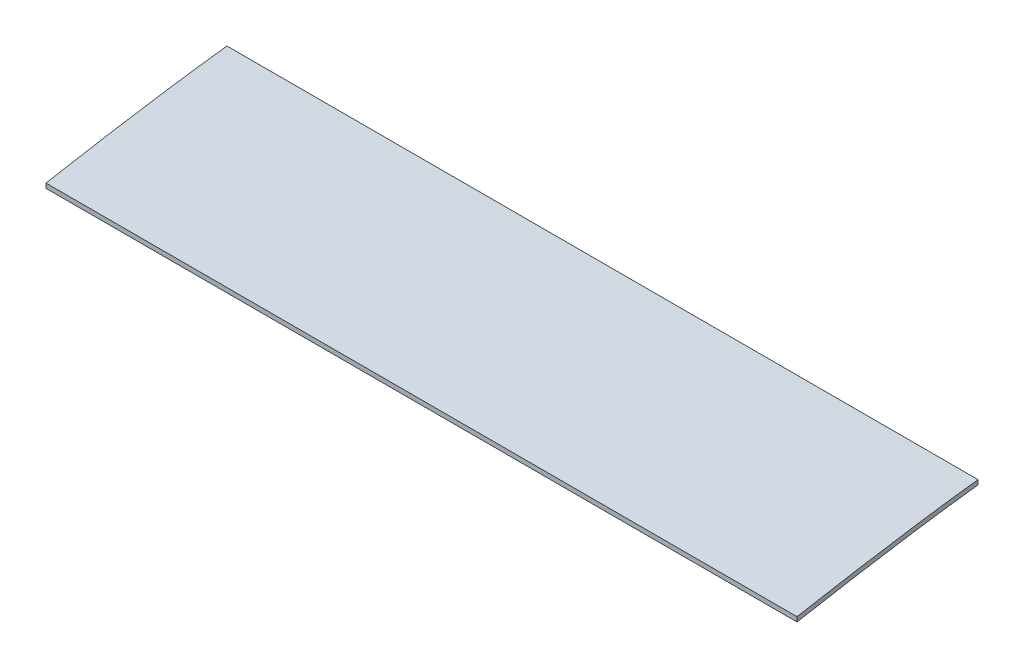
ISO-10303-21;
HEADER;
FILE_DESCRIPTION(('STEP AP214'),'2;1');
FILE_NAME('part.step','',(''),(''),'','','');
FILE_SCHEMA(('AUTOMOTIVE_DESIGN { 1 0 10303 214 1 1 1 1 }'));
ENDSEC;
DATA;
#1=APPLICATION_CONTEXT('core data for automotive mechanical design processes');
#2=APPLICATION_PROTOCOL_DEFINITION('international standard','automotive_design',2000,#1);
#3=PRODUCT_CONTEXT('',#1,'mechanical');
#4=PRODUCT('Part','Part','',(#3));
#5=PRODUCT_RELATED_PRODUCT_CATEGORY('part','',(#4));
#6=PRODUCT_DEFINITION_FORMATION('','',#4);
#7=PRODUCT_DEFINITION_CONTEXT('part definition',#1,'design');
#8=PRODUCT_DEFINITION('design','',#6,#7);
#9=PRODUCT_DEFINITION_SHAPE('','',#8);
#10=(LENGTH_UNIT() NAMED_UNIT(*) SI_UNIT(.MILLI.,.METRE.));
#11=(NAMED_UNIT(*) PLANE_ANGLE_UNIT() SI_UNIT($,.RADIAN.));
#12=(NAMED_UNIT(*) SI_UNIT($,.STERADIAN.) SOLID_ANGLE_UNIT());
#13=UNCERTAINTY_MEASURE_WITH_UNIT(LENGTH_MEASURE(1.E-05),#10,'distance_accuracy_value','');
#14=(GEOMETRIC_REPRESENTATION_CONTEXT(3) GLOBAL_UNCERTAINTY_ASSIGNED_CONTEXT((#13)) GLOBAL_UNIT_ASSIGNED_CONTEXT((#10,
#11,#12)) REPRESENTATION_CONTEXT('',''));
#15=CARTESIAN_POINT('',(0.,0.,0.));
#16=DIRECTION('',(0.,0.,1.));
#17=DIRECTION('',(1.,0.,0.));
#18=AXIS2_PLACEMENT_3D('',#15,#16,#17);
#19=CARTESIAN_POINT('',(392.594017665971,0.10670192770205,-3.17320653261408));
#20=CARTESIAN_POINT('',(392.594017665971,-0.152062727524062,-3.18190772721015));
#21=CARTESIAN_POINT('',(392.594017665971,-0.703636398814102,-3.20108457194396));
#22=CARTESIAN_POINT('',(392.594017665971,-1.32572499827971,-3.24669652660389));
#23=CARTESIAN_POINT('',(392.594017665971,-1.95692171648885,-3.33542236088719));
#24=CARTESIAN_POINT('',(392.594017665971,-2.86210384386158,-3.5122340399297));
#25=CARTESIAN_POINT('',(392.594017665971,-4.0788727127707,-3.82041700735137));
#26=CARTESIAN_POINT('',(392.594017665971,-6.00409475168733,-4.41619289085594));
#27=CARTESIAN_POINT('',(392.594017665971,-8.42720306713168,-5.34247677612119));
#28=CARTESIAN_POINT('',(392.594017665971,-12.2508144893029,-7.09398640801824));
#29=CARTESIAN_POINT('',(392.594017665971,-17.0200839271149,-9.71190537713497));
#30=CARTESIAN_POINT('',(392.594017665971,-22.7924961683345,-13.050433706946));
#31=CARTESIAN_POINT('',(392.594017665971,-28.4676662989809,-16.4405836434002));
#32=CARTESIAN_POINT('',(392.594017665971,-35.9751906455508,-21.0946249741854));
#33=CARTESIAN_POINT('',(392.594017665971,-45.1637363448745,-27.1466429818637));
#34=CARTESIAN_POINT('',(392.594017665971,-53.8739109411088,-33.7501113309221));
#35=CARTESIAN_POINT('',(392.594017665971,-60.5874109945328,-39.4068138181919));
#36=CARTESIAN_POINT('',(392.594017665971,-65.466346762527,-43.8008314323515));
#37=CARTESIAN_POINT('',(392.594017665971,-70.0243974974817,-48.3936290389788));
#38=CARTESIAN_POINT('',(392.594017665971,-75.4881405189106,-54.897290849477));
#39=CARTESIAN_POINT('',(392.594017665971,-81.1236894931899,-64.0360573140587));
#40=CARTESIAN_POINT('',(392.594017665971,-85.8337034518987,-76.0250973637299));
#41=CARTESIAN_POINT('',(392.594017665971,-89.2336955389783,-88.7539696537224));
#42=CARTESIAN_POINT('',(392.594017665971,-91.8371437531038,-101.650093768971));
#43=CARTESIAN_POINT('',(392.594017665971,-93.6633034173206,-114.708671502437));
#44=CARTESIAN_POINT('',(392.594017665971,-94.844262135333,-127.87777546883));
#45=CARTESIAN_POINT('',(392.594017665971,-95.7216293495582,-145.518333990535));
#46=CARTESIAN_POINT('',(392.594017665971,-95.7019099689116,-167.629487803099));
#47=CARTESIAN_POINT('',(392.594017665971,-94.3241241796722,-194.171525519723));
#48=CARTESIAN_POINT('',(392.594017665971,-91.919223829245,-220.666804050081));
#49=CARTESIAN_POINT('',(392.594017665971,-88.718245067685,-247.100628518263));
#50=CARTESIAN_POINT('',(392.594017665971,-83.6318296504294,-282.26219374487));
#51=CARTESIAN_POINT('',(392.594017665971,-76.1243366555826,-326.07213544255));
#52=CARTESIAN_POINT('',(392.594017665971,-66.1663408657687,-378.513802495921));
#53=CARTESIAN_POINT('',(392.594017665971,-56.6179491365967,-427.38371974186));
#54=CARTESIAN_POINT('',(392.594017665971,-48.9465575087565,-467.570792418126));
#55=CARTESIAN_POINT('',(392.594017665971,-42.5411528994735,-502.630545056134));
#56=CARTESIAN_POINT('',(392.594017665971,-36.0194326452385,-540.452640088853));
#57=CARTESIAN_POINT('',(392.594017665971,-30.8794178345618,-574.002925287078));
#58=CARTESIAN_POINT('',(392.594017665971,-26.8599286606229,-604.059703333701));
#59=CARTESIAN_POINT('',(392.594017665971,-24.6152496080385,-622.666261964029));
#60=CARTESIAN_POINT('',(392.594017665971,-21.2836863350976,-654.627522000997));
#61=CARTESIAN_POINT('',(392.594017665971,-18.8600698969768,-686.70095348516));
#62=CARTESIAN_POINT('',(392.594017665971,-17.853648720902,-722.448718678827));
#63=CARTESIAN_POINT('',(392.594017665971,-18.145429780217,-749.311049786414));
#64=CARTESIAN_POINT('',(392.594017665971,-19.7554955595627,-771.741445026258));
#65=CARTESIAN_POINT('',(392.594017665971,-21.9395719037182,-787.333615449083));
#66=CARTESIAN_POINT('',(392.594017665971,-23.2790746987312,-795.096743861096));
#67=CARTESIAN_POINT('',(392.594017665971,-24.1764693775422,-799.562880162077));
#68=CARTESIAN_POINT('',(392.594017665971,-24.667378489808,-801.749250248913));
#69=CARTESIAN_POINT('',(392.594017665971,-24.9139132147241,-802.84685765794));
#70=B_SPLINE_CURVE_WITH_KNOTS('',3,(#19,#20,#21,#22,#23,#24,#25,#26,#27,#28,#29,#30,#31,#32,#33,
#34,#35,#36,#37,#38,#39,#40,#41,#42,#43,#44,#45,#46,#47,#48,#49,#50,#51,#52,#53,#54,#55,#56,#57,
#58,#59,#60,#61,#62,#63,#64,#65,#66,#67,#68,#69),.UNSPECIFIED.,.F.,.F.,(4,1,1,1,1,1,1,1,1,1,1,1,
1,1,1,1,1,1,1,1,1,1,1,1,1,1,1,1,1,1,1,1,1,1,1,1,1,1,1,1,1,1,1,1,1,1,1,1,4),(0.,0.0009765625,
0.001953125,0.0029296875,0.00390625,0.005859375,0.0078125,0.01171875,0.015625,0.0234375,0.03125,
0.0390625,0.046875,0.0625,0.078125,0.0859375,0.09375,0.1015625,0.109375,0.125,0.140625,0.15625,
0.171875,0.1875,0.203125,0.21875,0.25,0.28125,0.3125,0.34375,0.375,0.4375,0.5,0.5625,
0.612293803259344,0.643543803259344,0.6875,0.746861687267416,0.762486687267416,
0.793736687267416,0.8125,0.875,0.90625,0.9375,0.96875,0.984375,0.9921875,0.99609375,1.),.UNSPECIFIED.);
#71=DIRECTION('',(-1.,0.,0.));
#72=VECTOR('',#71,1.);
#73=SURFACE_OF_LINEAR_EXTRUSION('',#70,#72);
#74=DIRECTION('',(-1.,0.,0.));
#75=VECTOR('',#74,1.);
#76=CARTESIAN_POINT('',(392.594017665971,-45.6021102361617,-485.921053398607));
#77=LINE('',#76,#75);
#78=CARTESIAN_POINT('',(263.525,-45.6021102361617,-485.921053398607));
#79=VERTEX_POINT('',#78);
#80=CARTESIAN_POINT('',(-263.525,-45.6021102361617,-485.921053398607));
#81=VERTEX_POINT('',#80);
#82=EDGE_CURVE('E80',#79,#81,#77,.T.);
#83=ORIENTED_EDGE('',*,*,#82,.F.);
#84=CARTESIAN_POINT('',(263.525,0.10670192770205,-3.17320653261408));
#85=CARTESIAN_POINT('',(263.525,-0.152062727524062,-3.18190772721015));
#86=CARTESIAN_POINT('',(263.525,-0.703636398814102,-3.20108457194396));
#87=CARTESIAN_POINT('',(263.525,-1.32572499827971,-3.24669652660389));
#88=CARTESIAN_POINT('',(263.525,-1.95692171648885,-3.33542236088719));
#89=CARTESIAN_POINT('',(263.525,-2.86210384386158,-3.5122340399297));
#90=CARTESIAN_POINT('',(263.525,-4.0788727127707,-3.82041700735137));
#91=CARTESIAN_POINT('',(263.525,-6.00409475168733,-4.41619289085594));
#92=CARTESIAN_POINT('',(263.525,-8.42720306713168,-5.34247677612119));
#93=CARTESIAN_POINT('',(263.525,-12.2508144893029,-7.09398640801824));
#94=CARTESIAN_POINT('',(263.525,-17.0200839271149,-9.71190537713497));
#95=CARTESIAN_POINT('',(263.525,-22.7924961683345,-13.050433706946));
#96=CARTESIAN_POINT('',(263.525,-28.4676662989809,-16.4405836434002));
#97=CARTESIAN_POINT('',(263.525,-35.9751906455508,-21.0946249741854));
#98=CARTESIAN_POINT('',(263.525,-45.1637363448745,-27.1466429818637));
#99=CARTESIAN_POINT('',(263.525,-53.8739109411088,-33.7501113309221));
#100=CARTESIAN_POINT('',(263.525,-60.5874109945328,-39.4068138181919));
#101=CARTESIAN_POINT('',(263.525,-65.466346762527,-43.8008314323515));
#102=CARTESIAN_POINT('',(263.525,-70.0243974974817,-48.3936290389788));
#103=CARTESIAN_POINT('',(263.525,-75.4881405189106,-54.897290849477));
#104=CARTESIAN_POINT('',(263.525,-81.1236894931899,-64.0360573140587));
#105=CARTESIAN_POINT('',(263.525,-85.8337034518987,-76.0250973637299));
#106=CARTESIAN_POINT('',(263.525,-89.2336955389783,-88.7539696537224));
#107=CARTESIAN_POINT('',(263.525,-91.8371437531038,-101.650093768971));
#108=CARTESIAN_POINT('',(263.525,-93.6633034173206,-114.708671502437));
#109=CARTESIAN_POINT('',(263.525,-94.844262135333,-127.87777546883));
#110=CARTESIAN_POINT('',(263.525,-95.7216293495582,-145.518333990535));
#111=CARTESIAN_POINT('',(263.525,-95.7019099689116,-167.629487803099));
#112=CARTESIAN_POINT('',(263.525,-94.3241241796722,-194.171525519723));
#113=CARTESIAN_POINT('',(263.525,-91.919223829245,-220.666804050081));
#114=CARTESIAN_POINT('',(263.525,-88.718245067685,-247.100628518263));
#115=CARTESIAN_POINT('',(263.525,-83.6318296504294,-282.26219374487));
#116=CARTESIAN_POINT('',(263.525,-76.1243366555826,-326.07213544255));
#117=CARTESIAN_POINT('',(263.525,-66.1663408657687,-378.513802495921));
#118=CARTESIAN_POINT('',(263.525,-56.6179491365967,-427.38371974186));
#119=CARTESIAN_POINT('',(263.525,-48.9465575087565,-467.570792418126));
#120=CARTESIAN_POINT('',(263.525,-42.5411528994735,-502.630545056134));
#121=CARTESIAN_POINT('',(263.525,-36.0194326452385,-540.452640088853));
#122=CARTESIAN_POINT('',(263.525,-30.8794178345618,-574.002925287078));
#123=CARTESIAN_POINT('',(263.525,-26.8599286606229,-604.059703333701));
#124=CARTESIAN_POINT('',(263.525,-24.6152496080385,-622.666261964029));
#125=CARTESIAN_POINT('',(263.525,-21.2836863350976,-654.627522000997));
#126=CARTESIAN_POINT('',(263.525,-18.8600698969768,-686.70095348516));
#127=CARTESIAN_POINT('',(263.525,-17.853648720902,-722.448718678827));
#128=CARTESIAN_POINT('',(263.525,-18.145429780217,-749.311049786414));
#129=CARTESIAN_POINT('',(263.525,-19.7554955595627,-771.741445026258));
#130=CARTESIAN_POINT('',(263.525,-21.9395719037182,-787.333615449083));
#131=CARTESIAN_POINT('',(263.525,-23.2790746987312,-795.096743861096));
#132=CARTESIAN_POINT('',(263.525,-24.1764693775422,-799.562880162077));
#133=CARTESIAN_POINT('',(263.525,-24.667378489808,-801.749250248913));
#134=CARTESIAN_POINT('',(263.525,-24.9139132147241,-802.84685765794));
#135=B_SPLINE_CURVE_WITH_KNOTS('',3,(#84,#85,#86,#87,#88,#89,#90,#91,#92,#93,#94,#95,#96,#97,
#98,#99,#100,#101,#102,#103,#104,#105,#106,#107,#108,#109,#110,#111,#112,#113,#114,#115,#116,
#117,#118,#119,#120,#121,#122,#123,#124,#125,#126,#127,#128,#129,#130,#131,#132,#133,#134),
.UNSPECIFIED.,.F.,.F.,(4,1,1,1,1,1,1,1,1,1,1,1,1,1,1,1,1,1,1,1,1,1,1,1,1,1,1,1,1,1,1,1,1,1,1,1,
1,1,1,1,1,1,1,1,1,1,1,1,4),(0.,0.0009765625,0.001953125,0.0029296875,0.00390625,0.005859375,
0.0078125,0.01171875,0.015625,0.0234375,0.03125,0.0390625,0.046875,0.0625,0.078125,0.0859375,
0.09375,0.1015625,0.109375,0.125,0.140625,0.15625,0.171875,0.1875,0.203125,0.21875,0.25,0.28125,
0.3125,0.34375,0.375,0.4375,0.5,0.5625,0.612293803259344,0.643543803259344,0.6875,
0.746861687267416,0.762486687267416,0.793736687267416,0.8125,0.875,0.90625,0.9375,0.96875,
0.984375,0.9921875,0.99609375,1.),.UNSPECIFIED.);
#136=CARTESIAN_POINT('',(263.525,-25.8119198953498,-612.921053398607));
#137=VERTEX_POINT('',#136);
#138=EDGE_CURVE('E44',#79,#137,#135,.T.);
#139=ORIENTED_EDGE('',*,*,#138,.T.);
#140=DIRECTION('',(-1.,0.,0.));
#141=VECTOR('',#140,1.);
#142=CARTESIAN_POINT('',(392.594017665971,-25.8119198953498,-612.921053398607));
#143=LINE('',#142,#141);
#144=CARTESIAN_POINT('',(-263.525,-25.8119198953498,-612.921053398607));
#145=VERTEX_POINT('',#144);
#146=EDGE_CURVE('E121',#137,#145,#143,.T.);
#147=ORIENTED_EDGE('',*,*,#146,.T.);
#148=CARTESIAN_POINT('',(-263.525,0.10670192770205,-3.17320653261408));
#149=CARTESIAN_POINT('',(-263.525,-0.152062727524062,-3.18190772721015));
#150=CARTESIAN_POINT('',(-263.525,-0.703636398814102,-3.20108457194396));
#151=CARTESIAN_POINT('',(-263.525,-1.32572499827971,-3.24669652660389));
#152=CARTESIAN_POINT('',(-263.525,-1.95692171648885,-3.33542236088719));
#153=CARTESIAN_POINT('',(-263.525,-2.86210384386158,-3.5122340399297));
#154=CARTESIAN_POINT('',(-263.525,-4.0788727127707,-3.82041700735137));
#155=CARTESIAN_POINT('',(-263.525,-6.00409475168733,-4.41619289085594));
#156=CARTESIAN_POINT('',(-263.525,-8.42720306713168,-5.34247677612119));
#157=CARTESIAN_POINT('',(-263.525,-12.2508144893029,-7.09398640801824));
#158=CARTESIAN_POINT('',(-263.525,-17.0200839271149,-9.71190537713497));
#159=CARTESIAN_POINT('',(-263.525,-22.7924961683345,-13.050433706946));
#160=CARTESIAN_POINT('',(-263.525,-28.4676662989809,-16.4405836434002));
#161=CARTESIAN_POINT('',(-263.525,-35.9751906455508,-21.0946249741854));
#162=CARTESIAN_POINT('',(-263.525,-45.1637363448745,-27.1466429818637));
#163=CARTESIAN_POINT('',(-263.525,-53.8739109411088,-33.7501113309221));
#164=CARTESIAN_POINT('',(-263.525,-60.5874109945328,-39.4068138181919));
#165=CARTESIAN_POINT('',(-263.525,-65.466346762527,-43.8008314323515));
#166=CARTESIAN_POINT('',(-263.525,-70.0243974974817,-48.3936290389788));
#167=CARTESIAN_POINT('',(-263.525,-75.4881405189106,-54.897290849477));
#168=CARTESIAN_POINT('',(-263.525,-81.1236894931899,-64.0360573140587));
#169=CARTESIAN_POINT('',(-263.525,-85.8337034518987,-76.0250973637299));
#170=CARTESIAN_POINT('',(-263.525,-89.2336955389783,-88.7539696537224));
#171=CARTESIAN_POINT('',(-263.525,-91.8371437531038,-101.650093768971));
#172=CARTESIAN_POINT('',(-263.525,-93.6633034173206,-114.708671502437));
#173=CARTESIAN_POINT('',(-263.525,-94.844262135333,-127.87777546883));
#174=CARTESIAN_POINT('',(-263.525,-95.7216293495582,-145.518333990535));
#175=CARTESIAN_POINT('',(-263.525,-95.7019099689116,-167.629487803099));
#176=CARTESIAN_POINT('',(-263.525,-94.3241241796722,-194.171525519723));
#177=CARTESIAN_POINT('',(-263.525,-91.919223829245,-220.666804050081));
#178=CARTESIAN_POINT('',(-263.525,-88.718245067685,-247.100628518263));
#179=CARTESIAN_POINT('',(-263.525,-83.6318296504294,-282.26219374487));
#180=CARTESIAN_POINT('',(-263.525,-76.1243366555826,-326.07213544255));
#181=CARTESIAN_POINT('',(-263.525,-66.1663408657687,-378.513802495921));
#182=CARTESIAN_POINT('',(-263.525,-56.6179491365967,-427.38371974186));
#183=CARTESIAN_POINT('',(-263.525,-48.9465575087565,-467.570792418126));
#184=CARTESIAN_POINT('',(-263.525,-42.5411528994735,-502.630545056134));
#185=CARTESIAN_POINT('',(-263.525,-36.0194326452385,-540.452640088853));
#186=CARTESIAN_POINT('',(-263.525,-30.8794178345618,-574.002925287078));
#187=CARTESIAN_POINT('',(-263.525,-26.8599286606229,-604.059703333701));
#188=CARTESIAN_POINT('',(-263.525,-24.6152496080385,-622.666261964029));
#189=CARTESIAN_POINT('',(-263.525,-21.2836863350976,-654.627522000997));
#190=CARTESIAN_POINT('',(-263.525,-18.8600698969768,-686.70095348516));
#191=CARTESIAN_POINT('',(-263.525,-17.853648720902,-722.448718678827));
#192=CARTESIAN_POINT('',(-263.525,-18.145429780217,-749.311049786414));
#193=CARTESIAN_POINT('',(-263.525,-19.7554955595627,-771.741445026258));
#194=CARTESIAN_POINT('',(-263.525,-21.9395719037182,-787.333615449083));
#195=CARTESIAN_POINT('',(-263.525,-23.2790746987312,-795.096743861096));
#196=CARTESIAN_POINT('',(-263.525,-24.1764693775422,-799.562880162077));
#197=CARTESIAN_POINT('',(-263.525,-24.667378489808,-801.749250248913));
#198=CARTESIAN_POINT('',(-263.525,-24.9139132147241,-802.84685765794));
#199=B_SPLINE_CURVE_WITH_KNOTS('',3,(#148,#149,#150,#151,#152,#153,#154,#155,#156,#157,#158,
#159,#160,#161,#162,#163,#164,#165,#166,#167,#168,#169,#170,#171,#172,#173,#174,#175,#176,#177,
#178,#179,#180,#181,#182,#183,#184,#185,#186,#187,#188,#189,#190,#191,#192,#193,#194,#195,#196,
#197,#198),.UNSPECIFIED.,.F.,.F.,(4,1,1,1,1,1,1,1,1,1,1,1,1,1,1,1,1,1,1,1,1,1,1,1,1,1,1,1,1,1,1,
1,1,1,1,1,1,1,1,1,1,1,1,1,1,1,1,1,4),(0.,0.0009765625,0.001953125,0.0029296875,0.00390625,
0.005859375,0.0078125,0.01171875,0.015625,0.0234375,0.03125,0.0390625,0.046875,0.0625,0.078125,
0.0859375,0.09375,0.1015625,0.109375,0.125,0.140625,0.15625,0.171875,0.1875,0.203125,0.21875,
0.25,0.28125,0.3125,0.34375,0.375,0.4375,0.5,0.5625,0.612293803259344,0.643543803259344,0.6875,
0.746861687267416,0.762486687267416,0.793736687267416,0.8125,0.875,0.90625,0.9375,0.96875,
0.984375,0.9921875,0.99609375,1.),.UNSPECIFIED.);
#200=EDGE_CURVE('E139',#145,#81,#199,.F.);
#201=ORIENTED_EDGE('',*,*,#200,.T.);
#202=EDGE_LOOP('',(#83,#139,#147,#201));
#203=FACE_BOUND('',#202,.T.);
#204=ADVANCED_FACE('F33',(#203),#73,.T.);
#205=CARTESIAN_POINT('',(392.594017665971,-8.35771831652528E-12,-485.921053398608));
#206=DIRECTION('',(0.,0.,1.));
#207=DIRECTION('',(0.,-1.,0.));
#208=AXIS2_PLACEMENT_3D('',#205,#206,#207);
#209=PLANE('',#208);
#210=DIRECTION('',(-1.,0.,0.));
#211=VECTOR('',#210,1.);
#212=CARTESIAN_POINT('',(392.594017665971,-48.8295505566051,-485.921053398607));
#213=LINE('',#212,#211);
#214=CARTESIAN_POINT('',(263.525,-48.8295505566051,-485.921053398607));
#215=VERTEX_POINT('',#214);
#216=CARTESIAN_POINT('',(-263.525,-48.8295505566051,-485.921053398607));
#217=VERTEX_POINT('',#216);
#218=EDGE_CURVE('E73',#215,#217,#213,.T.);
#219=ORIENTED_EDGE('',*,*,#218,.F.);
#220=DIRECTION('',(0.,1.,0.));
#221=VECTOR('',#220,1.);
#222=CARTESIAN_POINT('',(263.525,-8.35771831652528E-12,-485.921053398608));
#223=LINE('',#222,#221);
#224=EDGE_CURVE('E51',#215,#79,#223,.T.);
#225=ORIENTED_EDGE('',*,*,#224,.T.);
#226=ORIENTED_EDGE('',*,*,#82,.T.);
#227=DIRECTION('',(0.,-1.,0.));
#228=VECTOR('',#227,1.);
#229=CARTESIAN_POINT('',(-263.525,-8.35771831652528E-12,-485.921053398608));
#230=LINE('',#229,#228);
#231=EDGE_CURVE('E88',#81,#217,#230,.T.);
#232=ORIENTED_EDGE('',*,*,#231,.T.);
#233=EDGE_LOOP('',(#219,#225,#226,#232));
#234=FACE_BOUND('',#233,.T.);
#235=ADVANCED_FACE('F93',(#234),#209,.T.);
#236=CARTESIAN_POINT('',(392.594017665971,0.,0.));
#237=CARTESIAN_POINT('',(392.594017665971,-0.519005663292632,-0.0174520328861116));
#238=CARTESIAN_POINT('',(392.594017665971,-1.83376590693266,-0.061662030289511));
#239=CARTESIAN_POINT('',(392.594017665971,-4.39681155697538,-0.570189514846942));
#240=CARTESIAN_POINT('',(392.594017665971,-10.616386461847,-2.53612961983818));
#241=CARTESIAN_POINT('',(392.594017665971,-20.5501355548529,-7.99821180017807));
#242=CARTESIAN_POINT('',(392.594017665971,-34.1849518234535,-16.113653600375));
#243=CARTESIAN_POINT('',(392.594017665971,-48.9001609581786,-25.7512677237822));
#244=CARTESIAN_POINT('',(392.594017665971,-62.9387722638163,-36.9320129206869));
#245=CARTESIAN_POINT('',(392.594017665971,-75.9185649305712,-49.3363693896182));
#246=CARTESIAN_POINT('',(392.594017665971,-85.624987008219,-65.2269065390065));
#247=CARTESIAN_POINT('',(392.594017665971,-91.71735718507,-84.4527650462028));
#248=CARTESIAN_POINT('',(392.594017665971,-96.1515107337894,-106.852134497523));
#249=CARTESIAN_POINT('',(392.594017665971,-98.5722491750476,-132.510932075963));
#250=CARTESIAN_POINT('',(392.594017665971,-99.0923828679645,-161.194365788224));
#251=CARTESIAN_POINT('',(392.594017665971,-97.7042437107787,-192.761343292225));
#252=CARTESIAN_POINT('',(392.594017665971,-94.5118392960459,-227.038217577419));
#253=CARTESIAN_POINT('',(392.594017665971,-89.663828122523,-263.83475650239));
#254=CARTESIAN_POINT('',(392.594017665971,-83.3884450275924,-302.921473177171));
#255=CARTESIAN_POINT('',(392.594017665971,-75.9777868038423,-344.017776041379));
#256=CARTESIAN_POINT('',(392.594017665971,-67.7807073824771,-386.776799789042));
#257=CARTESIAN_POINT('',(392.594017665971,-59.2023239554423,-430.774614869895));
#258=CARTESIAN_POINT('',(392.594017665971,-50.6638051202139,-475.496263681326));
#259=CARTESIAN_POINT('',(392.594017665971,-42.603612471025,-520.335279967164));
#260=CARTESIAN_POINT('',(392.594017665971,-35.4227963472458,-564.588870456427));
#261=CARTESIAN_POINT('',(392.594017665971,-29.4733080838417,-607.47093439983));
#262=CARTESIAN_POINT('',(392.594017665971,-25.014473383068,-648.127538759033));
#263=CARTESIAN_POINT('',(392.594017665971,-22.1862417823146,-685.667615873141));
#264=CARTESIAN_POINT('',(392.594017665971,-21.0047614095552,-719.196759596274));
#265=CARTESIAN_POINT('',(392.594017665971,-21.2786363123237,-747.830287498204));
#266=CARTESIAN_POINT('',(392.594017665971,-22.8547119223691,-770.688405742871));
#267=CARTESIAN_POINT('',(392.594017665971,-25.0735156397946,-787.091395164099));
#268=CARTESIAN_POINT('',(392.594017665971,-26.8193281874914,-796.842303094868));
#269=CARTESIAN_POINT('',(392.594017665971,-27.775140745329,-801.097715575015));
#270=CARTESIAN_POINT('',(392.594017665971,-28.0117320332953,-802.151053398607));
#271=B_SPLINE_CURVE_WITH_KNOTS('',3,(#236,#237,#238,#239,#240,#241,#242,#243,#244,#245,#246,
#247,#248,#249,#250,#251,#252,#253,#254,#255,#256,#257,#258,#259,#260,#261,#262,#263,#264,#265,
#266,#267,#268,#269,#270),.UNSPECIFIED.,.F.,.F.,(4,1,1,1,1,1,1,1,1,1,1,1,1,1,1,1,1,1,1,1,1,1,1,
1,1,1,1,1,1,1,1,1,4),(0.,0.00182090933464196,0.00461278049497482,0.00913453013845994,
0.0246759391487866,0.0441527676320363,0.064937102928184,0.0863209881898911,0.107137618403306,
0.127599776801144,0.150892792929449,0.177565203441126,0.207667777211646,0.241222088418686,
0.278203414074027,0.318526302563412,0.362030578586225,0.408464624639153,0.457479061609077,
0.508614437318857,0.56129601455956,0.61483529472868,0.668437533813961,0.721214466101836,
0.772202341152847,0.82039348306447,0.86476592329606,0.904323703961063,0.938131580580512,
0.965241743376092,0.984690446789536,0.996210442222917,1.),.UNSPECIFIED.);
#272=DIRECTION('',(-1.,0.,0.));
#273=VECTOR('',#272,1.);
#274=SURFACE_OF_LINEAR_EXTRUSION('',#271,#273);
#275=CARTESIAN_POINT('',(263.525,0.,0.));
#276=CARTESIAN_POINT('',(263.525,-0.519005663292632,-0.0174520328861116));
#277=CARTESIAN_POINT('',(263.525,-1.83376590693266,-0.061662030289511));
#278=CARTESIAN_POINT('',(263.525,-4.39681155697538,-0.570189514846942));
#279=CARTESIAN_POINT('',(263.525,-10.616386461847,-2.53612961983818));
#280=CARTESIAN_POINT('',(263.525,-20.5501355548529,-7.99821180017807));
#281=CARTESIAN_POINT('',(263.525,-34.1849518234535,-16.113653600375));
#282=CARTESIAN_POINT('',(263.525,-48.9001609581786,-25.7512677237822));
#283=CARTESIAN_POINT('',(263.525,-62.9387722638163,-36.9320129206869));
#284=CARTESIAN_POINT('',(263.525,-75.9185649305712,-49.3363693896182));
#285=CARTESIAN_POINT('',(263.525,-85.624987008219,-65.2269065390065));
#286=CARTESIAN_POINT('',(263.525,-91.71735718507,-84.4527650462028));
#287=CARTESIAN_POINT('',(263.525,-96.1515107337894,-106.852134497523));
#288=CARTESIAN_POINT('',(263.525,-98.5722491750476,-132.510932075963));
#289=CARTESIAN_POINT('',(263.525,-99.0923828679645,-161.194365788224));
#290=CARTESIAN_POINT('',(263.525,-97.7042437107787,-192.761343292225));
#291=CARTESIAN_POINT('',(263.525,-94.5118392960459,-227.038217577419));
#292=CARTESIAN_POINT('',(263.525,-89.663828122523,-263.83475650239));
#293=CARTESIAN_POINT('',(263.525,-83.3884450275924,-302.921473177171));
#294=CARTESIAN_POINT('',(263.525,-75.9777868038423,-344.017776041379));
#295=CARTESIAN_POINT('',(263.525,-67.7807073824771,-386.776799789042));
#296=CARTESIAN_POINT('',(263.525,-59.2023239554423,-430.774614869895));
#297=CARTESIAN_POINT('',(263.525,-50.6638051202139,-475.496263681326));
#298=CARTESIAN_POINT('',(263.525,-42.603612471025,-520.335279967164));
#299=CARTESIAN_POINT('',(263.525,-35.4227963472458,-564.588870456427));
#300=CARTESIAN_POINT('',(263.525,-29.4733080838417,-607.47093439983));
#301=CARTESIAN_POINT('',(263.525,-25.014473383068,-648.127538759033));
#302=CARTESIAN_POINT('',(263.525,-22.1862417823146,-685.667615873141));
#303=CARTESIAN_POINT('',(263.525,-21.0047614095552,-719.196759596274));
#304=CARTESIAN_POINT('',(263.525,-21.2786363123237,-747.830287498204));
#305=CARTESIAN_POINT('',(263.525,-22.8547119223691,-770.688405742871));
#306=CARTESIAN_POINT('',(263.525,-25.0735156397946,-787.091395164099));
#307=CARTESIAN_POINT('',(263.525,-26.8193281874914,-796.842303094868));
#308=CARTESIAN_POINT('',(263.525,-27.775140745329,-801.097715575015));
#309=CARTESIAN_POINT('',(263.525,-28.0117320332953,-802.151053398607));
#310=B_SPLINE_CURVE_WITH_KNOTS('',3,(#275,#276,#277,#278,#279,#280,#281,#282,#283,#284,#285,
#286,#287,#288,#289,#290,#291,#292,#293,#294,#295,#296,#297,#298,#299,#300,#301,#302,#303,#304,
#305,#306,#307,#308,#309),.UNSPECIFIED.,.F.,.F.,(4,1,1,1,1,1,1,1,1,1,1,1,1,1,1,1,1,1,1,1,1,1,1,
1,1,1,1,1,1,1,1,1,4),(0.,0.00182090933464196,0.00461278049497482,0.00913453013845994,
0.0246759391487866,0.0441527676320363,0.064937102928184,0.0863209881898911,0.107137618403306,
0.127599776801144,0.150892792929449,0.177565203441126,0.207667777211646,0.241222088418686,
0.278203414074027,0.318526302563412,0.362030578586225,0.408464624639153,0.457479061609077,
0.508614437318857,0.56129601455956,0.61483529472868,0.668437533813961,0.721214466101836,
0.772202341152847,0.82039348306447,0.86476592329606,0.904323703961063,0.938131580580512,
0.965241743376092,0.984690446789536,0.996210442222917,1.),.UNSPECIFIED.);
#311=CARTESIAN_POINT('',(263.525,-29.0098437821382,-612.921053398607));
#312=VERTEX_POINT('',#311);
#313=EDGE_CURVE('E37',#215,#312,#310,.T.);
#314=ORIENTED_EDGE('',*,*,#313,.F.);
#315=ORIENTED_EDGE('',*,*,#218,.T.);
#316=CARTESIAN_POINT('',(-263.525,0.,0.));
#317=CARTESIAN_POINT('',(-263.525,-0.519005663292632,-0.0174520328861116));
#318=CARTESIAN_POINT('',(-263.525,-1.83376590693266,-0.061662030289511));
#319=CARTESIAN_POINT('',(-263.525,-4.39681155697538,-0.570189514846942));
#320=CARTESIAN_POINT('',(-263.525,-10.616386461847,-2.53612961983818));
#321=CARTESIAN_POINT('',(-263.525,-20.5501355548529,-7.99821180017807));
#322=CARTESIAN_POINT('',(-263.525,-34.1849518234535,-16.113653600375));
#323=CARTESIAN_POINT('',(-263.525,-48.9001609581786,-25.7512677237822));
#324=CARTESIAN_POINT('',(-263.525,-62.9387722638163,-36.9320129206869));
#325=CARTESIAN_POINT('',(-263.525,-75.9185649305712,-49.3363693896182));
#326=CARTESIAN_POINT('',(-263.525,-85.624987008219,-65.2269065390065));
#327=CARTESIAN_POINT('',(-263.525,-91.71735718507,-84.4527650462028));
#328=CARTESIAN_POINT('',(-263.525,-96.1515107337894,-106.852134497523));
#329=CARTESIAN_POINT('',(-263.525,-98.5722491750476,-132.510932075963));
#330=CARTESIAN_POINT('',(-263.525,-99.0923828679645,-161.194365788224));
#331=CARTESIAN_POINT('',(-263.525,-97.7042437107787,-192.761343292225));
#332=CARTESIAN_POINT('',(-263.525,-94.5118392960459,-227.038217577419));
#333=CARTESIAN_POINT('',(-263.525,-89.663828122523,-263.83475650239));
#334=CARTESIAN_POINT('',(-263.525,-83.3884450275924,-302.921473177171));
#335=CARTESIAN_POINT('',(-263.525,-75.9777868038423,-344.017776041379));
#336=CARTESIAN_POINT('',(-263.525,-67.7807073824771,-386.776799789042));
#337=CARTESIAN_POINT('',(-263.525,-59.2023239554423,-430.774614869895));
#338=CARTESIAN_POINT('',(-263.525,-50.6638051202139,-475.496263681326));
#339=CARTESIAN_POINT('',(-263.525,-42.603612471025,-520.335279967164));
#340=CARTESIAN_POINT('',(-263.525,-35.4227963472458,-564.588870456427));
#341=CARTESIAN_POINT('',(-263.525,-29.4733080838417,-607.47093439983));
#342=CARTESIAN_POINT('',(-263.525,-25.014473383068,-648.127538759033));
#343=CARTESIAN_POINT('',(-263.525,-22.1862417823146,-685.667615873141));
#344=CARTESIAN_POINT('',(-263.525,-21.0047614095552,-719.196759596274));
#345=CARTESIAN_POINT('',(-263.525,-21.2786363123237,-747.830287498204));
#346=CARTESIAN_POINT('',(-263.525,-22.8547119223691,-770.688405742871));
#347=CARTESIAN_POINT('',(-263.525,-25.0735156397946,-787.091395164099));
#348=CARTESIAN_POINT('',(-263.525,-26.8193281874914,-796.842303094868));
#349=CARTESIAN_POINT('',(-263.525,-27.775140745329,-801.097715575015));
#350=CARTESIAN_POINT('',(-263.525,-28.0117320332953,-802.151053398607));
#351=B_SPLINE_CURVE_WITH_KNOTS('',3,(#316,#317,#318,#319,#320,#321,#322,#323,#324,#325,#326,
#327,#328,#329,#330,#331,#332,#333,#334,#335,#336,#337,#338,#339,#340,#341,#342,#343,#344,#345,
#346,#347,#348,#349,#350),.UNSPECIFIED.,.F.,.F.,(4,1,1,1,1,1,1,1,1,1,1,1,1,1,1,1,1,1,1,1,1,1,1,
1,1,1,1,1,1,1,1,1,4),(0.,0.00182090933464196,0.00461278049497482,0.00913453013845994,
0.0246759391487866,0.0441527676320363,0.064937102928184,0.0863209881898911,0.107137618403306,
0.127599776801144,0.150892792929449,0.177565203441126,0.207667777211646,0.241222088418686,
0.278203414074027,0.318526302563412,0.362030578586225,0.408464624639153,0.457479061609077,
0.508614437318857,0.56129601455956,0.61483529472868,0.668437533813961,0.721214466101836,
0.772202341152847,0.82039348306447,0.86476592329606,0.904323703961063,0.938131580580512,
0.965241743376092,0.984690446789536,0.996210442222917,1.),.UNSPECIFIED.);
#352=CARTESIAN_POINT('',(-263.525,-29.0098437821375,-612.921053398612));
#353=VERTEX_POINT('',#352);
#354=EDGE_CURVE('E77',#353,#217,#351,.F.);
#355=ORIENTED_EDGE('',*,*,#354,.F.);
#356=DIRECTION('',(-1.,0.,0.));
#357=VECTOR('',#356,1.);
#358=CARTESIAN_POINT('',(392.594017665971,-29.0098437821382,-612.921053398607));
#359=LINE('',#358,#357);
#360=EDGE_CURVE('E81',#312,#353,#359,.T.);
#361=ORIENTED_EDGE('',*,*,#360,.F.);
#362=EDGE_LOOP('',(#314,#315,#355,#361));
#363=FACE_BOUND('',#362,.T.);
#364=ADVANCED_FACE('F75',(#363),#274,.F.);
#365=CARTESIAN_POINT('',(392.594017665971,-2.12787761638702E-11,-612.921053398608));
#366=DIRECTION('',(0.,0.,1.));
#367=DIRECTION('',(0.,-1.,0.));
#368=AXIS2_PLACEMENT_3D('',#365,#366,#367);
#369=PLANE('',#368);
#370=DIRECTION('',(0.,1.,0.));
#371=VECTOR('',#370,1.);
#372=CARTESIAN_POINT('',(263.525,-2.12787761638702E-11,-612.921053398608));
#373=LINE('',#372,#371);
#374=EDGE_CURVE('E11',#312,#137,#373,.T.);
#375=ORIENTED_EDGE('',*,*,#374,.F.);
#376=ORIENTED_EDGE('',*,*,#360,.T.);
#377=DIRECTION('',(0.,-1.,0.));
#378=VECTOR('',#377,1.);
#379=CARTESIAN_POINT('',(-263.525,-2.12787761638702E-11,-612.921053398608));
#380=LINE('',#379,#378);
#381=EDGE_CURVE('E91',#145,#353,#380,.T.);
#382=ORIENTED_EDGE('',*,*,#381,.F.);
#383=ORIENTED_EDGE('',*,*,#146,.F.);
#384=EDGE_LOOP('',(#375,#376,#382,#383));
#385=FACE_BOUND('',#384,.T.);
#386=ADVANCED_FACE('F129',(#385),#369,.F.);
#387=CARTESIAN_POINT('',(263.525,0.,0.));
#388=DIRECTION('',(1.,0.,0.));
#389=DIRECTION('',(0.,0.,-1.));
#390=AXIS2_PLACEMENT_3D('',#387,#388,#389);
#391=PLANE('',#390);
#392=ORIENTED_EDGE('',*,*,#313,.T.);
#393=ORIENTED_EDGE('',*,*,#374,.T.);
#394=ORIENTED_EDGE('',*,*,#138,.F.);
#395=ORIENTED_EDGE('',*,*,#224,.F.);
#396=EDGE_LOOP('',(#392,#393,#394,#395));
#397=FACE_BOUND('',#396,.T.);
#398=ADVANCED_FACE('F149',(#397),#391,.T.);
#399=CARTESIAN_POINT('',(-263.525,0.,0.));
#400=DIRECTION('',(1.,0.,0.));
#401=DIRECTION('',(0.,0.,-1.));
#402=AXIS2_PLACEMENT_3D('',#399,#400,#401);
#403=PLANE('',#402);
#404=ORIENTED_EDGE('',*,*,#381,.T.);
#405=ORIENTED_EDGE('',*,*,#354,.T.);
#406=ORIENTED_EDGE('',*,*,#231,.F.);
#407=ORIENTED_EDGE('',*,*,#200,.F.);
#408=EDGE_LOOP('',(#404,#405,#406,#407));
#409=FACE_BOUND('',#408,.T.);
#410=ADVANCED_FACE('F86',(#409),#403,.F.);
#411=CLOSED_SHELL('',(#204,#235,#364,#386,#398,#410));
#412=MANIFOLD_SOLID_BREP('B2',#411);
#413=ADVANCED_BREP_SHAPE_REPRESENTATION('',(#18,#412),#14);
#414=SHAPE_DEFINITION_REPRESENTATION(#9,#413);
ENDSEC;
END-ISO-10303-21;
